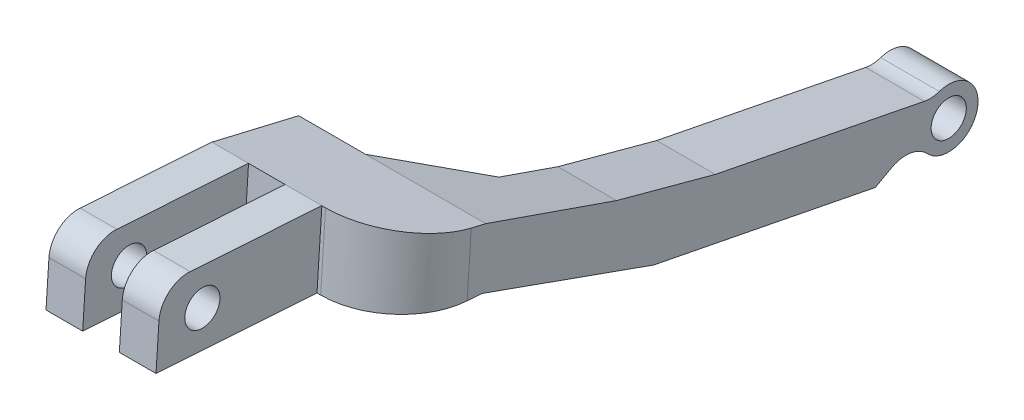
ISO-10303-21;
HEADER;
FILE_DESCRIPTION(('STEP AP214'),'2;1');
FILE_NAME('part.step','',(''),(''),'','','');
FILE_SCHEMA(('AUTOMOTIVE_DESIGN { 1 0 10303 214 1 1 1 1 }'));
ENDSEC;
DATA;
#1=APPLICATION_CONTEXT('core data for automotive mechanical design processes');
#2=APPLICATION_PROTOCOL_DEFINITION('international standard','automotive_design',2000,#1);
#3=PRODUCT_CONTEXT('',#1,'mechanical');
#4=PRODUCT('Part','Part','',(#3));
#5=PRODUCT_RELATED_PRODUCT_CATEGORY('part','',(#4));
#6=PRODUCT_DEFINITION_FORMATION('','',#4);
#7=PRODUCT_DEFINITION_CONTEXT('part definition',#1,'design');
#8=PRODUCT_DEFINITION('design','',#6,#7);
#9=PRODUCT_DEFINITION_SHAPE('','',#8);
#10=(LENGTH_UNIT() NAMED_UNIT(*) SI_UNIT(.MILLI.,.METRE.));
#11=(NAMED_UNIT(*) PLANE_ANGLE_UNIT() SI_UNIT($,.RADIAN.));
#12=(NAMED_UNIT(*) SI_UNIT($,.STERADIAN.) SOLID_ANGLE_UNIT());
#13=UNCERTAINTY_MEASURE_WITH_UNIT(LENGTH_MEASURE(1.E-05),#10,'distance_accuracy_value','');
#14=(GEOMETRIC_REPRESENTATION_CONTEXT(3) GLOBAL_UNCERTAINTY_ASSIGNED_CONTEXT((#13)) GLOBAL_UNIT_ASSIGNED_CONTEXT((#10,
#11,#12)) REPRESENTATION_CONTEXT('',''));
#15=CARTESIAN_POINT('',(0.,0.,0.));
#16=DIRECTION('',(0.,0.,1.));
#17=DIRECTION('',(1.,0.,0.));
#18=AXIS2_PLACEMENT_3D('',#15,#16,#17);
#19=CARTESIAN_POINT('',(-2.,0.,0.));
#20=DIRECTION('',(1.,0.,0.));
#21=DIRECTION('',(0.,0.,-1.));
#22=AXIS2_PLACEMENT_3D('',#19,#20,#21);
#23=PLANE('',#22);
#24=CARTESIAN_POINT('',(-2.,2.82842712474617,2.82842712474621));
#25=DIRECTION('',(1.,0.,0.));
#26=DIRECTION('',(0.,0.,-1.));
#27=AXIS2_PLACEMENT_3D('',#24,#25,#26);
#28=CIRCLE('',#27,1.2);
#29=CARTESIAN_POINT('',(-2.,2.82842712474617,1.62842712474621));
#30=VERTEX_POINT('',#29);
#31=EDGE_CURVE('E336',#30,#30,#28,.T.);
#32=ORIENTED_EDGE('',*,*,#31,.T.);
#33=EDGE_LOOP('',(#32));
#34=FACE_BOUND('',#33,.T.);
#35=DIRECTION('',(0.,-0.335768666523311,-0.941944479564033));
#36=VECTOR('',#35,1.);
#37=CARTESIAN_POINT('',(-2.,-3.51720209807534,1.2537535746378));
#38=LINE('',#37,#36);
#39=CARTESIAN_POINT('',(-2.,6.64655444127387,29.7665223895568));
#40=VERTEX_POINT('',#39);
#41=CARTESIAN_POINT('',(-2.,4.21314419530496,22.939985025488));
#42=VERTEX_POINT('',#41);
#43=EDGE_CURVE('E323',#40,#42,#38,.T.);
#44=ORIENTED_EDGE('',*,*,#43,.F.);
#45=DIRECTION('',(0.,0.997782154890409,-0.0665640397080232));
#46=VECTOR('',#45,1.);
#47=CARTESIAN_POINT('',(-2.,12.0496495140297,29.4060711295234));
#48=LINE('',#47,#46);
#49=CARTESIAN_POINT('',(-2.,10.6823280378961,29.4972878751676));
#50=VERTEX_POINT('',#49);
#51=EDGE_CURVE('E375',#40,#50,#48,.T.);
#52=ORIENTED_EDGE('',*,*,#51,.T.);
#53=DIRECTION('',(0.,-0.327934825038129,-0.944700349596216));
#54=VECTOR('',#53,1.);
#55=CARTESIAN_POINT('',(-2.,0.395273106266088,-0.13721156872764));
#56=LINE('',#55,#54);
#57=CARTESIAN_POINT('',(-2.,9.28430122630332,25.469913175018));
#58=VERTEX_POINT('',#57);
#59=EDGE_CURVE('E321',#50,#58,#56,.T.);
#60=ORIENTED_EDGE('',*,*,#59,.T.);
#61=DIRECTION('',(0.,-0.261237027153609,-0.965274684037629));
#62=VECTOR('',#61,1.);
#63=CARTESIAN_POINT('',(-2.,2.22806298460891,-0.602991625115011));
#64=LINE('',#63,#62);
#65=CARTESIAN_POINT('',(-2.,7.46200384373997,18.7364973597243));
#66=VERTEX_POINT('',#65);
#67=EDGE_CURVE('E371',#66,#58,#64,.F.);
#68=ORIENTED_EDGE('',*,*,#67,.F.);
#69=DIRECTION('',(0.,0.193266508732253,0.981146297247483));
#70=VECTOR('',#69,1.);
#71=CARTESIAN_POINT('',(-2.,3.63041791669355,-0.715120872357937));
#72=LINE('',#71,#70);
#73=CARTESIAN_POINT('',(-2.,4.65637088782305,4.49328261863853));
#74=VERTEX_POINT('',#73);
#75=EDGE_CURVE('E318',#74,#66,#72,.T.);
#76=ORIENTED_EDGE('',*,*,#75,.F.);
#77=CARTESIAN_POINT('',(-2.,6.61866348231801,4.10674960117403));
#78=DIRECTION('',(1.,0.,0.));
#79=DIRECTION('',(0.,0.,-1.));
#80=AXIS2_PLACEMENT_3D('',#77,#78,#79);
#81=CIRCLE('',#80,2.);
#82=CARTESIAN_POINT('',(-2.,4.72354530353209,3.46758836296012));
#83=VERTEX_POINT('',#82);
#84=EDGE_CURVE('E316',#74,#83,#81,.T.);
#85=ORIENTED_EDGE('',*,*,#84,.T.);
#86=CARTESIAN_POINT('',(-2.,2.82842712474617,2.82842712474621));
#87=DIRECTION('',(1.,0.,0.));
#88=DIRECTION('',(0.,0.,-1.));
#89=AXIS2_PLACEMENT_3D('',#86,#87,#88);
#90=CIRCLE('',#89,2.);
#91=CARTESIAN_POINT('',(-2.,1.46299909190755,4.28979849682739));
#92=VERTEX_POINT('',#91);
#93=EDGE_CURVE('E333',#92,#83,#90,.T.);
#94=ORIENTED_EDGE('',*,*,#93,.F.);
#95=CARTESIAN_POINT('',(-2.,0.0975710590689317,5.75116986890858));
#96=DIRECTION('',(1.,0.,0.));
#97=DIRECTION('',(0.,0.,-1.));
#98=AXIS2_PLACEMENT_3D('',#95,#96,#97);
#99=CIRCLE('',#98,2.);
#100=CARTESIAN_POINT('',(-2.,1.84923303121626,6.71640576511889));
#101=VERTEX_POINT('',#100);
#102=EDGE_CURVE('E331',#92,#101,#99,.T.);
#103=ORIENTED_EDGE('',*,*,#102,.T.);
#104=DIRECTION('',(0.,0.482617948105157,-0.875830986073665));
#105=VECTOR('',#104,1.);
#106=CARTESIAN_POINT('',(-2.,4.25747884786671,2.34604134625321));
#107=LINE('',#106,#105);
#108=CARTESIAN_POINT('',(-2.,1.23646472846601,7.8284271247462));
#109=VERTEX_POINT('',#108);
#110=EDGE_CURVE('E328',#109,#101,#107,.T.);
#111=ORIENTED_EDGE('',*,*,#110,.F.);
#112=DIRECTION('',(0.,0.193266508732253,0.981146297247483));
#113=VECTOR('',#112,1.);
#114=CARTESIAN_POINT('',(-2.,-0.294167272296385,0.0579451625710735));
#115=LINE('',#114,#113);
#116=EDGE_CURVE('E325',#109,#42,#115,.T.);
#117=ORIENTED_EDGE('',*,*,#116,.T.);
#118=EDGE_LOOP('',(#44,#52,#60,#68,#76,#85,#94,#103,#111,#117));
#119=FACE_BOUND('',#118,.T.);
#120=ADVANCED_FACE('F43',(#34,#119),#23,.F.);
#121=CARTESIAN_POINT('',(-2.,9.28430122630331,25.469913175018));
#122=DIRECTION('',(0.,-0.965274684037629,0.261237027153608));
#123=DIRECTION('',(-1.,0.,0.));
#124=AXIS2_PLACEMENT_3D('',#121,#122,#123);
#125=PLANE('',#124);
#126=DIRECTION('',(-1.,0.,0.));
#127=VECTOR('',#126,1.);
#128=CARTESIAN_POINT('',(-2.,9.28430122630331,25.469913175018));
#129=LINE('',#128,#127);
#130=CARTESIAN_POINT('',(2.,9.28430122630332,25.469913175018));
#131=VERTEX_POINT('',#130);
#132=EDGE_CURVE('E342',#131,#58,#129,.T.);
#133=ORIENTED_EDGE('',*,*,#132,.F.);
#134=DIRECTION('',(0.,0.261237027153609,0.965274684037629));
#135=VECTOR('',#134,1.);
#136=CARTESIAN_POINT('',(2.,9.28430122630331,25.469913175018));
#137=LINE('',#136,#135);
#138=CARTESIAN_POINT('',(2.,7.46200384373997,18.7364973597243));
#139=VERTEX_POINT('',#138);
#140=EDGE_CURVE('E369',#131,#139,#137,.F.);
#141=ORIENTED_EDGE('',*,*,#140,.T.);
#142=DIRECTION('',(1.,0.,0.));
#143=VECTOR('',#142,1.);
#144=CARTESIAN_POINT('',(-2.,7.46200384373995,18.7364973597242));
#145=LINE('',#144,#143);
#146=EDGE_CURVE('E366',#66,#139,#145,.T.);
#147=ORIENTED_EDGE('',*,*,#146,.F.);
#148=ORIENTED_EDGE('',*,*,#67,.T.);
#149=EDGE_LOOP('',(#133,#141,#147,#148));
#150=FACE_BOUND('',#149,.T.);
#151=ADVANCED_FACE('F425',(#150),#125,.F.);
#152=CARTESIAN_POINT('',(-2.,6.61866348231801,4.10674960117403));
#153=DIRECTION('',(1.,0.,0.));
#154=DIRECTION('',(0.,0.,-1.));
#155=AXIS2_PLACEMENT_3D('',#152,#153,#154);
#156=CYLINDRICAL_SURFACE('',#155,2.);
#157=DIRECTION('',(1.,0.,0.));
#158=VECTOR('',#157,1.);
#159=CARTESIAN_POINT('',(-2.,4.65637088782305,4.49328261863853));
#160=LINE('',#159,#158);
#161=CARTESIAN_POINT('',(2.,4.65637088782305,4.49328261863853));
#162=VERTEX_POINT('',#161);
#163=EDGE_CURVE('E339',#74,#162,#160,.T.);
#164=ORIENTED_EDGE('',*,*,#163,.T.);
#165=CARTESIAN_POINT('',(2.,6.61866348231801,4.10674960117403));
#166=DIRECTION('',(1.,0.,0.));
#167=DIRECTION('',(0.,0.,-1.));
#168=AXIS2_PLACEMENT_3D('',#165,#166,#167);
#169=CIRCLE('',#168,2.);
#170=CARTESIAN_POINT('',(2.,4.72354530353209,3.46758836296012));
#171=VERTEX_POINT('',#170);
#172=EDGE_CURVE('E285',#162,#171,#169,.T.);
#173=ORIENTED_EDGE('',*,*,#172,.T.);
#174=DIRECTION('',(1.,0.,0.));
#175=VECTOR('',#174,1.);
#176=CARTESIAN_POINT('',(-2.,4.72354530353209,3.46758836296012));
#177=LINE('',#176,#175);
#178=EDGE_CURVE('E340',#83,#171,#177,.T.);
#179=ORIENTED_EDGE('',*,*,#178,.F.);
#180=ORIENTED_EDGE('',*,*,#84,.F.);
#181=EDGE_LOOP('',(#164,#173,#179,#180));
#182=FACE_BOUND('',#181,.T.);
#183=ADVANCED_FACE('F431',(#182),#156,.F.);
#184=CARTESIAN_POINT('',(-2.,2.82842712474617,2.82842712474621));
#185=DIRECTION('',(1.,0.,0.));
#186=DIRECTION('',(0.,0.,-1.));
#187=AXIS2_PLACEMENT_3D('',#184,#185,#186);
#188=CYLINDRICAL_SURFACE('',#187,2.);
#189=ORIENTED_EDGE('',*,*,#178,.T.);
#190=CARTESIAN_POINT('',(2.,2.82842712474617,2.82842712474621));
#191=DIRECTION('',(1.,0.,0.));
#192=DIRECTION('',(0.,0.,-1.));
#193=AXIS2_PLACEMENT_3D('',#190,#191,#192);
#194=CIRCLE('',#193,2.);
#195=CARTESIAN_POINT('',(2.,1.46299909190755,4.28979849682739));
#196=VERTEX_POINT('',#195);
#197=EDGE_CURVE('E310',#196,#171,#194,.T.);
#198=ORIENTED_EDGE('',*,*,#197,.F.);
#199=DIRECTION('',(1.,0.,0.));
#200=VECTOR('',#199,1.);
#201=CARTESIAN_POINT('',(-2.,1.46299909190755,4.28979849682739));
#202=LINE('',#201,#200);
#203=EDGE_CURVE('E343',#92,#196,#202,.T.);
#204=ORIENTED_EDGE('',*,*,#203,.F.);
#205=ORIENTED_EDGE('',*,*,#93,.T.);
#206=EDGE_LOOP('',(#189,#198,#204,#205));
#207=FACE_BOUND('',#206,.T.);
#208=ADVANCED_FACE('F444',(#207),#188,.T.);
#209=CARTESIAN_POINT('',(-2.,0.0975710590689317,5.75116986890858));
#210=DIRECTION('',(1.,0.,0.));
#211=DIRECTION('',(0.,0.,-1.));
#212=AXIS2_PLACEMENT_3D('',#209,#210,#211);
#213=CYLINDRICAL_SURFACE('',#212,2.);
#214=ORIENTED_EDGE('',*,*,#203,.T.);
#215=CARTESIAN_POINT('',(2.,0.0975710590689317,5.75116986890858));
#216=DIRECTION('',(1.,0.,0.));
#217=DIRECTION('',(0.,0.,-1.));
#218=AXIS2_PLACEMENT_3D('',#215,#216,#217);
#219=CIRCLE('',#218,2.);
#220=CARTESIAN_POINT('',(2.,1.84923303121626,6.71640576511889));
#221=VERTEX_POINT('',#220);
#222=EDGE_CURVE('E307',#196,#221,#219,.T.);
#223=ORIENTED_EDGE('',*,*,#222,.T.);
#224=DIRECTION('',(1.,0.,0.));
#225=VECTOR('',#224,1.);
#226=CARTESIAN_POINT('',(-2.,1.84923303121626,6.71640576511889));
#227=LINE('',#226,#225);
#228=EDGE_CURVE('E345',#101,#221,#227,.T.);
#229=ORIENTED_EDGE('',*,*,#228,.F.);
#230=ORIENTED_EDGE('',*,*,#102,.F.);
#231=EDGE_LOOP('',(#214,#223,#229,#230));
#232=FACE_BOUND('',#231,.T.);
#233=ADVANCED_FACE('F447',(#232),#213,.F.);
#234=CARTESIAN_POINT('',(-2.,4.25747884786671,2.34604134625321));
#235=DIRECTION('',(0.,-0.875830986073665,-0.482617948105157));
#236=DIRECTION('',(0.,0.482617948105157,-0.875830986073665));
#237=AXIS2_PLACEMENT_3D('',#234,#235,#236);
#238=PLANE('',#237);
#239=ORIENTED_EDGE('',*,*,#228,.T.);
#240=DIRECTION('',(0.,0.482617948105157,-0.875830986073665));
#241=VECTOR('',#240,1.);
#242=CARTESIAN_POINT('',(2.,4.25747884786671,2.34604134625321));
#243=LINE('',#242,#241);
#244=CARTESIAN_POINT('',(2.,1.23646472846601,7.8284271247462));
#245=VERTEX_POINT('',#244);
#246=EDGE_CURVE('E304',#245,#221,#243,.T.);
#247=ORIENTED_EDGE('',*,*,#246,.F.);
#248=DIRECTION('',(1.,0.,0.));
#249=VECTOR('',#248,1.);
#250=CARTESIAN_POINT('',(-2.,1.23646472846601,7.8284271247462));
#251=LINE('',#250,#249);
#252=EDGE_CURVE('E347',#109,#245,#251,.T.);
#253=ORIENTED_EDGE('',*,*,#252,.F.);
#254=ORIENTED_EDGE('',*,*,#110,.T.);
#255=EDGE_LOOP('',(#239,#247,#253,#254));
#256=FACE_BOUND('',#255,.T.);
#257=ADVANCED_FACE('F451',(#256),#238,.T.);
#258=CARTESIAN_POINT('',(-2.,-0.294167272296385,0.0579451625710735));
#259=DIRECTION('',(0.,0.981146297247483,-0.193266508732253));
#260=DIRECTION('',(0.,0.193266508732253,0.981146297247483));
#261=AXIS2_PLACEMENT_3D('',#258,#259,#260);
#262=PLANE('',#261);
#263=ORIENTED_EDGE('',*,*,#252,.T.);
#264=DIRECTION('',(0.,0.193266508732253,0.981146297247483));
#265=VECTOR('',#264,1.);
#266=CARTESIAN_POINT('',(2.,-0.294167272296385,0.0579451625710735));
#267=LINE('',#266,#265);
#268=CARTESIAN_POINT('',(2.,4.21314419530496,22.939985025488));
#269=VERTEX_POINT('',#268);
#270=EDGE_CURVE('E301',#245,#269,#267,.T.);
#271=ORIENTED_EDGE('',*,*,#270,.T.);
#272=DIRECTION('',(1.,0.,0.));
#273=VECTOR('',#272,1.);
#274=CARTESIAN_POINT('',(-2.,4.21314419530496,22.939985025488));
#275=LINE('',#274,#273);
#276=EDGE_CURVE('E349',#42,#269,#275,.T.);
#277=ORIENTED_EDGE('',*,*,#276,.F.);
#278=ORIENTED_EDGE('',*,*,#116,.F.);
#279=EDGE_LOOP('',(#263,#271,#277,#278));
#280=FACE_BOUND('',#279,.T.);
#281=ADVANCED_FACE('F455',(#280),#262,.F.);
#282=CARTESIAN_POINT('',(-2.,-3.51720209807534,1.2537535746378));
#283=DIRECTION('',(0.,-0.941944479564033,0.335768666523311));
#284=DIRECTION('',(0.,-0.335768666523311,-0.941944479564033));
#285=AXIS2_PLACEMENT_3D('',#282,#283,#284);
#286=PLANE('',#285);
#287=ORIENTED_EDGE('',*,*,#276,.T.);
#288=DIRECTION('',(0.,-0.335768666523311,-0.941944479564033));
#289=VECTOR('',#288,1.);
#290=CARTESIAN_POINT('',(2.,-3.51720209807534,1.2537535746378));
#291=LINE('',#290,#289);
#292=CARTESIAN_POINT('',(2.,8.39134109300816,34.6612380628075));
#293=VERTEX_POINT('',#292);
#294=EDGE_CURVE('E298',#293,#269,#291,.T.);
#295=ORIENTED_EDGE('',*,*,#294,.F.);
#296=DIRECTION('',(1.,0.,0.));
#297=VECTOR('',#296,1.);
#298=CARTESIAN_POINT('',(-2.,8.39134109300816,34.6612380628075));
#299=LINE('',#298,#297);
#300=CARTESIAN_POINT('',(-6.19549815588643,8.39134109300816,34.6612380628075));
#301=VERTEX_POINT('',#300);
#302=EDGE_CURVE('E351',#301,#293,#299,.T.);
#303=ORIENTED_EDGE('',*,*,#302,.F.);
#304=DIRECTION('',(-0.628193000253413,0.261247346758396,0.732887016015644));
#305=VECTOR('',#304,1.);
#306=CARTESIAN_POINT('',(-5.38815038264097,8.05558844440082,33.7193385189061));
#307=LINE('',#306,#305);
#308=EDGE_CURVE('E377',#301,#40,#307,.F.);
#309=ORIENTED_EDGE('',*,*,#308,.T.);
#310=ORIENTED_EDGE('',*,*,#43,.T.);
#311=EDGE_LOOP('',(#287,#295,#303,#309,#310));
#312=FACE_BOUND('',#311,.T.);
#313=ADVANCED_FACE('F459',(#312),#286,.T.);
#314=CARTESIAN_POINT('',(-2.,6.05208594684601,-0.403746737008409));
#315=DIRECTION('',(0.,0.997782154890409,-0.0665640397080224));
#316=DIRECTION('',(0.,0.0665640397080224,0.997782154890409));
#317=AXIS2_PLACEMENT_3D('',#314,#315,#316);
#318=PLANE('',#317);
#319=DIRECTION('',(0.,0.0665640397080224,0.997782154890409));
#320=VECTOR('',#319,1.);
#321=CARTESIAN_POINT('',(2.,6.05208594684601,-0.403746737008409));
#322=LINE('',#321,#320);
#323=CARTESIAN_POINT('',(2.,8.45790513271618,35.6590202176979));
#324=VERTEX_POINT('',#323);
#325=EDGE_CURVE('E296',#293,#324,#322,.T.);
#326=ORIENTED_EDGE('',*,*,#325,.T.);
#327=CARTESIAN_POINT('',(-3.,8.45790513271618,35.6590202176979));
#328=DIRECTION('',(0.,0.997782154890409,-0.0665640397080224));
#329=DIRECTION('',(0.,0.0665640397080224,0.997782154890409));
#330=AXIS2_PLACEMENT_3D('',#327,#328,#329);
#331=CIRCLE('',#330,5.);
#332=CARTESIAN_POINT('',(-3.,8.79072533125629,40.64793099215));
#333=VERTEX_POINT('',#332);
#334=EDGE_CURVE('E385',#324,#333,#331,.F.);
#335=ORIENTED_EDGE('',*,*,#334,.T.);
#336=DIRECTION('',(1.,0.,0.));
#337=VECTOR('',#336,1.);
#338=CARTESIAN_POINT('',(-2.,8.79072533125629,40.64793099215));
#339=LINE('',#338,#337);
#340=CARTESIAN_POINT('',(-3.25,8.79072533125629,40.64793099215));
#341=VERTEX_POINT('',#340);
#342=EDGE_CURVE('E353',#341,#333,#339,.T.);
#343=ORIENTED_EDGE('',*,*,#342,.F.);
#344=DIRECTION('',(0.,0.0665640397080224,0.997782154890409));
#345=VECTOR('',#344,1.);
#346=CARTESIAN_POINT('',(-3.25,6.05208594684601,-0.403746737008409));
#347=LINE('',#346,#345);
#348=CARTESIAN_POINT('',(-3.25,9.52292976804454,51.6235346959445));
#349=VERTEX_POINT('',#348);
#350=EDGE_CURVE('E264',#341,#349,#347,.T.);
#351=ORIENTED_EDGE('',*,*,#350,.T.);
#352=DIRECTION('',(-1.,0.,0.));
#353=VECTOR('',#352,1.);
#354=CARTESIAN_POINT('',(-3.25,9.52292976804454,51.6235346959445));
#355=LINE('',#354,#353);
#356=CARTESIAN_POINT('',(-5.75,9.52292976804454,51.6235346959445));
#357=VERTEX_POINT('',#356);
#358=EDGE_CURVE('E273',#349,#357,#355,.T.);
#359=ORIENTED_EDGE('',*,*,#358,.T.);
#360=DIRECTION('',(0.,0.0665640397080224,0.997782154890409));
#361=VECTOR('',#360,1.);
#362=CARTESIAN_POINT('',(-5.75,6.05208594684601,-0.403746737008409));
#363=LINE('',#362,#361);
#364=CARTESIAN_POINT('',(-5.75,8.79072533125629,40.64793099215));
#365=VERTEX_POINT('',#364);
#366=EDGE_CURVE('E210',#365,#357,#363,.T.);
#367=ORIENTED_EDGE('',*,*,#366,.F.);
#368=DIRECTION('',(1.,0.,0.));
#369=VECTOR('',#368,1.);
#370=CARTESIAN_POINT('',(-8.25,8.79072533125629,40.64793099215));
#371=LINE('',#370,#369);
#372=CARTESIAN_POINT('',(-8.25,8.79072533125629,40.64793099215));
#373=VERTEX_POINT('',#372);
#374=EDGE_CURVE('E255',#373,#365,#371,.T.);
#375=ORIENTED_EDGE('',*,*,#374,.F.);
#376=DIRECTION('',(0.,-0.0665640397080222,-0.997782154890409));
#377=VECTOR('',#376,1.);
#378=CARTESIAN_POINT('',(-8.25,6.05208594684602,-0.403746737008409));
#379=LINE('',#378,#377);
#380=CARTESIAN_POINT('',(-8.25,9.52292976804454,51.6235346959445));
#381=VERTEX_POINT('',#380);
#382=EDGE_CURVE('E238',#381,#373,#379,.T.);
#383=ORIENTED_EDGE('',*,*,#382,.F.);
#384=DIRECTION('',(1.,0.,0.));
#385=VECTOR('',#384,1.);
#386=CARTESIAN_POINT('',(-10.75,9.52292976804454,51.6235346959445));
#387=LINE('',#386,#385);
#388=CARTESIAN_POINT('',(-10.75,9.52292976804454,51.6235346959445));
#389=VERTEX_POINT('',#388);
#390=EDGE_CURVE('E227',#389,#381,#387,.T.);
#391=ORIENTED_EDGE('',*,*,#390,.F.);
#392=DIRECTION('',(0.,-0.0665640397080222,-0.997782154890409));
#393=VECTOR('',#392,1.);
#394=CARTESIAN_POINT('',(-10.75,6.05208594684602,-0.403746737008409));
#395=LINE('',#394,#393);
#396=CARTESIAN_POINT('',(-10.75,8.39134109300816,34.6612380628075));
#397=VERTEX_POINT('',#396);
#398=EDGE_CURVE('E216',#389,#397,#395,.T.);
#399=ORIENTED_EDGE('',*,*,#398,.T.);
#400=DIRECTION('',(1.,0.,0.));
#401=VECTOR('',#400,1.);
#402=CARTESIAN_POINT('',(-5.75,8.39134109300816,34.6612380628075));
#403=LINE('',#402,#401);
#404=EDGE_CURVE('E200',#397,#301,#403,.T.);
#405=ORIENTED_EDGE('',*,*,#404,.T.);
#406=ORIENTED_EDGE('',*,*,#302,.T.);
#407=EDGE_LOOP('',(#326,#335,#343,#351,#359,#367,#375,#383,#391,#399,#405,#406));
#408=FACE_BOUND('',#407,.T.);
#409=ADVANCED_FACE('F224',(#408),#318,.F.);
#410=CARTESIAN_POINT('',(-2.,2.73863938441032,41.0516777291584));
#411=DIRECTION('',(0.,0.0665640397080232,0.997782154890409));
#412=DIRECTION('',(0.,-0.997782154890409,0.0665640397080232));
#413=AXIS2_PLACEMENT_3D('',#410,#411,#412);
#414=PLANE('',#413);
#415=ORIENTED_EDGE('',*,*,#342,.T.);
#416=DIRECTION('',(0.,-0.997782154890409,0.0665640397080232));
#417=VECTOR('',#416,1.);
#418=CARTESIAN_POINT('',(-3.,2.73863938441032,41.0516777291584));
#419=LINE('',#418,#417);
#420=CARTESIAN_POINT('',(-3.,13.7796361057083,40.3151107936098));
#421=VERTEX_POINT('',#420);
#422=EDGE_CURVE('E387',#333,#421,#419,.F.);
#423=ORIENTED_EDGE('',*,*,#422,.T.);
#424=DIRECTION('',(1.,0.,0.));
#425=VECTOR('',#424,1.);
#426=CARTESIAN_POINT('',(-2.,13.7796361057083,40.3151107936098));
#427=LINE('',#426,#425);
#428=CARTESIAN_POINT('',(-3.25,13.7796361057083,40.3151107936098));
#429=VERTEX_POINT('',#428);
#430=EDGE_CURVE('E359',#429,#421,#427,.T.);
#431=ORIENTED_EDGE('',*,*,#430,.F.);
#432=DIRECTION('',(0.,0.997782154890409,-0.0665640397080232));
#433=VECTOR('',#432,1.);
#434=CARTESIAN_POINT('',(-3.25,2.73863938441032,41.0516777291584));
#435=LINE('',#434,#433);
#436=EDGE_CURVE('E279',#341,#429,#435,.T.);
#437=ORIENTED_EDGE('',*,*,#436,.F.);
#438=EDGE_LOOP('',(#415,#423,#431,#437));
#439=FACE_BOUND('',#438,.T.);
#440=ADVANCED_FACE('F466',(#439),#414,.T.);
#441=CARTESIAN_POINT('',(-2.,4.04013657737562,-0.953483134376078));
#442=DIRECTION('',(0.,-0.97326319417309,0.229692740129056));
#443=DIRECTION('',(0.,-0.229692740129056,-0.97326319417309));
#444=AXIS2_PLACEMENT_3D('',#441,#442,#443);
#445=PLANE('',#444);
#446=ORIENTED_EDGE('',*,*,#430,.T.);
#447=CARTESIAN_POINT('',(-3.,12.6153307780929,35.3816700522478));
#448=DIRECTION('',(0.,-0.97326319417309,0.229692740129056));
#449=DIRECTION('',(0.,-0.229692740129056,-0.97326319417309));
#450=AXIS2_PLACEMENT_3D('',#447,#448,#449);
#451=ELLIPSE('',#450,5.06896877524852,5.);
#452=CARTESIAN_POINT('',(2.,12.6153307780929,35.3816700522478));
#453=VERTEX_POINT('',#452);
#454=EDGE_CURVE('E389',#421,#453,#451,.F.);
#455=ORIENTED_EDGE('',*,*,#454,.T.);
#456=DIRECTION('',(0.,-0.229692740129056,-0.97326319417309));
#457=VECTOR('',#456,1.);
#458=CARTESIAN_POINT('',(2.,4.04013657737562,-0.953483134376078));
#459=LINE('',#458,#457);
#460=CARTESIAN_POINT('',(2.,12.3824697125698,34.3949819039754));
#461=VERTEX_POINT('',#460);
#462=EDGE_CURVE('E294',#453,#461,#459,.T.);
#463=ORIENTED_EDGE('',*,*,#462,.T.);
#464=DIRECTION('',(1.,0.,0.));
#465=VECTOR('',#464,1.);
#466=CARTESIAN_POINT('',(-2.,12.3824697125698,34.3949819039754));
#467=LINE('',#466,#465);
#468=CARTESIAN_POINT('',(-6.19549815588643,12.3824697125698,34.3949819039754));
#469=VERTEX_POINT('',#468);
#470=EDGE_CURVE('E360',#469,#461,#467,.T.);
#471=ORIENTED_EDGE('',*,*,#470,.F.);
#472=DIRECTION('',(1.,0.,0.));
#473=VECTOR('',#472,1.);
#474=CARTESIAN_POINT('',(-5.75,12.3824697125698,34.3949819039754));
#475=LINE('',#474,#473);
#476=CARTESIAN_POINT('',(-10.75,12.3824697125698,34.3949819039754));
#477=VERTEX_POINT('',#476);
#478=EDGE_CURVE('E209',#477,#469,#475,.T.);
#479=ORIENTED_EDGE('',*,*,#478,.F.);
#480=DIRECTION('',(0.,-0.229692740129056,-0.97326319417309));
#481=VECTOR('',#480,1.);
#482=CARTESIAN_POINT('',(-10.75,4.04013657737562,-0.953483134376078));
#483=LINE('',#482,#481);
#484=CARTESIAN_POINT('',(-10.75,13.7796361057083,40.3151107936099));
#485=VERTEX_POINT('',#484);
#486=EDGE_CURVE('E219',#485,#477,#483,.T.);
#487=ORIENTED_EDGE('',*,*,#486,.F.);
#488=DIRECTION('',(1.,0.,0.));
#489=VECTOR('',#488,1.);
#490=CARTESIAN_POINT('',(-10.75,13.7796361057083,40.3151107936099));
#491=LINE('',#490,#489);
#492=CARTESIAN_POINT('',(-8.25,13.7796361057083,40.3151107936099));
#493=VERTEX_POINT('',#492);
#494=EDGE_CURVE('E237',#485,#493,#491,.T.);
#495=ORIENTED_EDGE('',*,*,#494,.T.);
#496=DIRECTION('',(1.,0.,0.));
#497=VECTOR('',#496,1.);
#498=CARTESIAN_POINT('',(-8.25,13.7796361057083,40.3151107936099));
#499=LINE('',#498,#497);
#500=CARTESIAN_POINT('',(-5.75,13.7796361057083,40.3151107936099));
#501=VERTEX_POINT('',#500);
#502=EDGE_CURVE('E251',#493,#501,#499,.T.);
#503=ORIENTED_EDGE('',*,*,#502,.T.);
#504=EDGE_CURVE('E356',#501,#429,#427,.T.);
#505=ORIENTED_EDGE('',*,*,#504,.T.);
#506=EDGE_LOOP('',(#446,#455,#463,#471,#479,#487,#495,#503,#505));
#507=FACE_BOUND('',#506,.T.);
#508=ADVANCED_FACE('F415',(#507),#445,.F.);
#509=CARTESIAN_POINT('',(-2.,0.395273106266088,-0.13721156872764));
#510=DIRECTION('',(0.,-0.944700349596216,0.327934825038129));
#511=DIRECTION('',(0.,-0.327934825038129,-0.944700349596216));
#512=AXIS2_PLACEMENT_3D('',#509,#510,#511);
#513=PLANE('',#512);
#514=DIRECTION('',(0.,-0.327934825038129,-0.944700349596216));
#515=VECTOR('',#514,1.);
#516=CARTESIAN_POINT('',(2.,0.395273106266088,-0.13721156872764));
#517=LINE('',#516,#515);
#518=EDGE_CURVE('E291',#461,#131,#517,.T.);
#519=ORIENTED_EDGE('',*,*,#518,.T.);
#520=ORIENTED_EDGE('',*,*,#132,.T.);
#521=ORIENTED_EDGE('',*,*,#59,.F.);
#522=DIRECTION('',(0.629072484740799,-0.254919036538683,-0.734359648777236));
#523=VECTOR('',#522,1.);
#524=CARTESIAN_POINT('',(13.3397732185501,4.46619189389365,11.590113827111));
#525=LINE('',#524,#523);
#526=EDGE_CURVE('E379',#50,#469,#525,.F.);
#527=ORIENTED_EDGE('',*,*,#526,.T.);
#528=ORIENTED_EDGE('',*,*,#470,.T.);
#529=EDGE_LOOP('',(#519,#520,#521,#527,#528));
#530=FACE_BOUND('',#529,.T.);
#531=ADVANCED_FACE('F472',(#530),#513,.F.);
#532=CARTESIAN_POINT('',(-2.,3.63041791669355,-0.715120872357937));
#533=DIRECTION('',(0.,0.981146297247483,-0.193266508732253));
#534=DIRECTION('',(0.,0.193266508732253,0.981146297247483));
#535=AXIS2_PLACEMENT_3D('',#532,#533,#534);
#536=PLANE('',#535);
#537=ORIENTED_EDGE('',*,*,#75,.T.);
#538=ORIENTED_EDGE('',*,*,#146,.T.);
#539=DIRECTION('',(0.,0.193266508732253,0.981146297247483));
#540=VECTOR('',#539,1.);
#541=CARTESIAN_POINT('',(2.,3.63041791669355,-0.715120872357937));
#542=LINE('',#541,#540);
#543=EDGE_CURVE('E288',#162,#139,#542,.T.);
#544=ORIENTED_EDGE('',*,*,#543,.F.);
#545=ORIENTED_EDGE('',*,*,#163,.F.);
#546=EDGE_LOOP('',(#537,#538,#544,#545));
#547=FACE_BOUND('',#546,.T.);
#548=ADVANCED_FACE('F442',(#547),#536,.T.);
#549=CARTESIAN_POINT('',(-2.,2.82842712474617,2.82842712474621));
#550=DIRECTION('',(1.,0.,0.));
#551=DIRECTION('',(0.,0.,-1.));
#552=AXIS2_PLACEMENT_3D('',#549,#550,#551);
#553=CYLINDRICAL_SURFACE('',#552,1.2);
#554=ORIENTED_EDGE('',*,*,#31,.F.);
#555=EDGE_LOOP('',(#554));
#556=FACE_BOUND('',#555,.T.);
#557=CARTESIAN_POINT('',(2.,2.82842712474617,2.82842712474621));
#558=DIRECTION('',(1.,0.,0.));
#559=DIRECTION('',(0.,0.,-1.));
#560=AXIS2_PLACEMENT_3D('',#557,#558,#559);
#561=CIRCLE('',#560,1.2);
#562=CARTESIAN_POINT('',(2.,2.82842712474617,1.62842712474621));
#563=VERTEX_POINT('',#562);
#564=EDGE_CURVE('E313',#563,#563,#561,.T.);
#565=ORIENTED_EDGE('',*,*,#564,.T.);
#566=EDGE_LOOP('',(#565));
#567=FACE_BOUND('',#566,.T.);
#568=ADVANCED_FACE('F439',(#556,#567),#553,.F.);
#569=CARTESIAN_POINT('',(2.,0.,0.));
#570=DIRECTION('',(1.,0.,0.));
#571=DIRECTION('',(0.,0.,-1.));
#572=AXIS2_PLACEMENT_3D('',#569,#570,#571);
#573=PLANE('',#572);
#574=ORIENTED_EDGE('',*,*,#462,.F.);
#575=DIRECTION('',(0.,-0.997782154890409,0.0665640397080232));
#576=VECTOR('',#575,1.);
#577=CARTESIAN_POINT('',(2.,2.4058191858702,36.0627669547063));
#578=LINE('',#577,#576);
#579=EDGE_CURVE('E382',#453,#324,#578,.T.);
#580=ORIENTED_EDGE('',*,*,#579,.T.);
#581=ORIENTED_EDGE('',*,*,#325,.F.);
#582=ORIENTED_EDGE('',*,*,#294,.T.);
#583=ORIENTED_EDGE('',*,*,#270,.F.);
#584=ORIENTED_EDGE('',*,*,#246,.T.);
#585=ORIENTED_EDGE('',*,*,#222,.F.);
#586=ORIENTED_EDGE('',*,*,#197,.T.);
#587=ORIENTED_EDGE('',*,*,#172,.F.);
#588=ORIENTED_EDGE('',*,*,#543,.T.);
#589=ORIENTED_EDGE('',*,*,#140,.F.);
#590=ORIENTED_EDGE('',*,*,#518,.F.);
#591=EDGE_LOOP('',(#574,#580,#581,#582,#583,#584,#585,#586,#587,#588,#589,#590));
#592=FACE_BOUND('',#591,.T.);
#593=ORIENTED_EDGE('',*,*,#564,.F.);
#594=EDGE_LOOP('',(#593));
#595=FACE_BOUND('',#594,.T.);
#596=ADVANCED_FACE('F437',(#592,#595),#573,.T.);
#597=CARTESIAN_POINT('',(-5.75,2.33925514616218,35.0649847998159));
#598=DIRECTION('',(0.,0.0665640397080232,0.997782154890409));
#599=DIRECTION('',(0.,-0.997782154890409,0.0665640397080232));
#600=AXIS2_PLACEMENT_3D('',#597,#598,#599);
#601=PLANE('',#600);
#602=ORIENTED_EDGE('',*,*,#478,.T.);
#603=DIRECTION('',(0.,-0.997782154890409,0.0665640397080232));
#604=VECTOR('',#603,1.);
#605=CARTESIAN_POINT('',(-6.19549815588643,8.39134109300816,34.6612380628075));
#606=LINE('',#605,#604);
#607=EDGE_CURVE('E206',#469,#301,#606,.T.);
#608=ORIENTED_EDGE('',*,*,#607,.T.);
#609=ORIENTED_EDGE('',*,*,#404,.F.);
#610=DIRECTION('',(0.,-0.997782154890409,0.0665640397080232));
#611=VECTOR('',#610,1.);
#612=CARTESIAN_POINT('',(-10.75,2.33925514616218,35.0649847998159));
#613=LINE('',#612,#611);
#614=EDGE_CURVE('E204',#477,#397,#613,.T.);
#615=ORIENTED_EDGE('',*,*,#614,.F.);
#616=EDGE_LOOP('',(#602,#608,#609,#615));
#617=FACE_BOUND('',#616,.T.);
#618=ADVANCED_FACE('F203',(#617),#601,.F.);
#619=CARTESIAN_POINT('',(-5.75,0.,0.));
#620=DIRECTION('',(1.,0.,0.));
#621=DIRECTION('',(0.,0.,-1.));
#622=AXIS2_PLACEMENT_3D('',#619,#620,#621);
#623=PLANE('',#622);
#624=DIRECTION('',(0.,-0.997782154890409,0.0665640397080225));
#625=VECTOR('',#624,1.);
#626=CARTESIAN_POINT('',(-5.75,3.47084382119853,52.0272814329529));
#627=LINE('',#626,#625);
#628=CARTESIAN_POINT('',(-5.75,12.5162762327158,51.4238425768204));
#629=VERTEX_POINT('',#628);
#630=EDGE_CURVE('E261',#629,#357,#627,.T.);
#631=ORIENTED_EDGE('',*,*,#630,.F.);
#632=CARTESIAN_POINT('',(-5.75,12.3831481532997,49.4282782670396));
#633=DIRECTION('',(1.,0.,0.));
#634=DIRECTION('',(0.,0.,-1.));
#635=AXIS2_PLACEMENT_3D('',#632,#633,#634);
#636=CIRCLE('',#635,2.);
#637=CARTESIAN_POINT('',(-5.75,14.3787124630805,49.2951501876235));
#638=VERTEX_POINT('',#637);
#639=EDGE_CURVE('E394',#629,#638,#636,.F.);
#640=ORIENTED_EDGE('',*,*,#639,.T.);
#641=DIRECTION('',(0.,0.066564039708022,0.99778215489041));
#642=VECTOR('',#641,1.);
#643=CARTESIAN_POINT('',(-5.75,11.0409967212981,-0.736566935548518));
#644=LINE('',#643,#642);
#645=EDGE_CURVE('E268',#501,#638,#644,.T.);
#646=ORIENTED_EDGE('',*,*,#645,.F.);
#647=DIRECTION('',(0.,-0.997782154890409,0.0665640397080232));
#648=VECTOR('',#647,1.);
#649=CARTESIAN_POINT('',(-5.75,2.73863938441032,41.0516777291584));
#650=LINE('',#649,#648);
#651=EDGE_CURVE('E247',#501,#365,#650,.T.);
#652=ORIENTED_EDGE('',*,*,#651,.T.);
#653=ORIENTED_EDGE('',*,*,#366,.T.);
#654=EDGE_LOOP('',(#631,#640,#646,#652,#653));
#655=FACE_BOUND('',#654,.T.);
#656=CARTESIAN_POINT('',(-5.75,11.8176930361465,48.4637781320032));
#657=DIRECTION('',(1.,0.,0.));
#658=DIRECTION('',(0.,0.,-1.));
#659=AXIS2_PLACEMENT_3D('',#656,#657,#658);
#660=CIRCLE('',#659,1.2);
#661=CARTESIAN_POINT('',(-5.75,11.8176930361465,47.2637781320032));
#662=VERTEX_POINT('',#661);
#663=EDGE_CURVE('E257',#662,#662,#660,.T.);
#664=ORIENTED_EDGE('',*,*,#663,.T.);
#665=EDGE_LOOP('',(#664));
#666=FACE_BOUND('',#665,.T.);
#667=ADVANCED_FACE('F531',(#655,#666),#623,.F.);
#668=CARTESIAN_POINT('',(-3.25,0.,0.));
#669=DIRECTION('',(1.,0.,0.));
#670=DIRECTION('',(0.,0.,-1.));
#671=AXIS2_PLACEMENT_3D('',#668,#669,#670);
#672=PLANE('',#671);
#673=DIRECTION('',(0.,0.066564039708022,0.99778215489041));
#674=VECTOR('',#673,1.);
#675=CARTESIAN_POINT('',(-3.25,11.0409967212981,-0.736566935548518));
#676=LINE('',#675,#674);
#677=CARTESIAN_POINT('',(-3.25,14.3787124630805,49.2951501876235));
#678=VERTEX_POINT('',#677);
#679=EDGE_CURVE('E270',#429,#678,#676,.T.);
#680=ORIENTED_EDGE('',*,*,#679,.T.);
#681=CARTESIAN_POINT('',(-3.25,12.3831481532997,49.4282782670396));
#682=DIRECTION('',(1.,0.,0.));
#683=DIRECTION('',(0.,0.,-1.));
#684=AXIS2_PLACEMENT_3D('',#681,#682,#683);
#685=CIRCLE('',#684,2.);
#686=CARTESIAN_POINT('',(-3.25,12.5162762327158,51.4238425768204));
#687=VERTEX_POINT('',#686);
#688=EDGE_CURVE('E398',#678,#687,#685,.T.);
#689=ORIENTED_EDGE('',*,*,#688,.T.);
#690=DIRECTION('',(0.,-0.997782154890409,0.0665640397080225));
#691=VECTOR('',#690,1.);
#692=CARTESIAN_POINT('',(-3.25,3.47084382119853,52.0272814329529));
#693=LINE('',#692,#691);
#694=EDGE_CURVE('E267',#687,#349,#693,.T.);
#695=ORIENTED_EDGE('',*,*,#694,.T.);
#696=ORIENTED_EDGE('',*,*,#350,.F.);
#697=ORIENTED_EDGE('',*,*,#436,.T.);
#698=EDGE_LOOP('',(#680,#689,#695,#696,#697));
#699=FACE_BOUND('',#698,.T.);
#700=CARTESIAN_POINT('',(-3.25,11.8176930361465,48.4637781320032));
#701=DIRECTION('',(1.,0.,0.));
#702=DIRECTION('',(0.,0.,-1.));
#703=AXIS2_PLACEMENT_3D('',#700,#701,#702);
#704=CIRCLE('',#703,1.2);
#705=CARTESIAN_POINT('',(-3.25,11.8176930361465,47.2637781320032));
#706=VERTEX_POINT('',#705);
#707=EDGE_CURVE('E258',#706,#706,#704,.T.);
#708=ORIENTED_EDGE('',*,*,#707,.F.);
#709=EDGE_LOOP('',(#708));
#710=FACE_BOUND('',#709,.T.);
#711=ADVANCED_FACE('F520',(#699,#710),#672,.T.);
#712=CARTESIAN_POINT('',(-3.25,11.0409967212981,-0.736566935548518));
#713=DIRECTION('',(0.,-0.997782154890409,0.066564039708022));
#714=DIRECTION('',(0.,-0.066564039708022,-0.997782154890409));
#715=AXIS2_PLACEMENT_3D('',#712,#713,#714);
#716=PLANE('',#715);
#717=ORIENTED_EDGE('',*,*,#645,.T.);
#718=DIRECTION('',(-1.,0.,0.));
#719=VECTOR('',#718,1.);
#720=CARTESIAN_POINT('',(-3.25,14.3787124630805,49.2951501876235));
#721=LINE('',#720,#719);
#722=EDGE_CURVE('E396',#638,#678,#721,.F.);
#723=ORIENTED_EDGE('',*,*,#722,.T.);
#724=ORIENTED_EDGE('',*,*,#679,.F.);
#725=ORIENTED_EDGE('',*,*,#504,.F.);
#726=EDGE_LOOP('',(#717,#723,#724,#725));
#727=FACE_BOUND('',#726,.T.);
#728=ADVANCED_FACE('F537',(#727),#716,.F.);
#729=CARTESIAN_POINT('',(-3.25,3.47084382119853,52.0272814329529));
#730=DIRECTION('',(0.,-0.0665640397080225,-0.997782154890409));
#731=DIRECTION('',(0.,0.997782154890409,-0.0665640397080225));
#732=AXIS2_PLACEMENT_3D('',#729,#730,#731);
#733=PLANE('',#732);
#734=ORIENTED_EDGE('',*,*,#694,.F.);
#735=DIRECTION('',(-1.,0.,0.));
#736=VECTOR('',#735,1.);
#737=CARTESIAN_POINT('',(-3.25,12.5162762327158,51.4238425768204));
#738=LINE('',#737,#736);
#739=EDGE_CURVE('E391',#687,#629,#738,.T.);
#740=ORIENTED_EDGE('',*,*,#739,.T.);
#741=ORIENTED_EDGE('',*,*,#630,.T.);
#742=ORIENTED_EDGE('',*,*,#358,.F.);
#743=EDGE_LOOP('',(#734,#740,#741,#742));
#744=FACE_BOUND('',#743,.T.);
#745=ADVANCED_FACE('F527',(#744),#733,.F.);
#746=CARTESIAN_POINT('',(-3.25,11.8176930361465,48.4637781320032));
#747=DIRECTION('',(-1.,0.,0.));
#748=DIRECTION('',(0.,0.,1.));
#749=AXIS2_PLACEMENT_3D('',#746,#747,#748);
#750=CYLINDRICAL_SURFACE('',#749,1.2);
#751=ORIENTED_EDGE('',*,*,#707,.T.);
#752=EDGE_LOOP('',(#751));
#753=FACE_BOUND('',#752,.T.);
#754=ORIENTED_EDGE('',*,*,#663,.F.);
#755=EDGE_LOOP('',(#754));
#756=FACE_BOUND('',#755,.T.);
#757=ADVANCED_FACE('F545',(#753,#756),#750,.F.);
#758=CARTESIAN_POINT('',(-8.25,2.73863938441032,41.0516777291584));
#759=DIRECTION('',(0.,0.0665640397080232,0.997782154890409));
#760=DIRECTION('',(0.,-0.997782154890409,0.0665640397080232));
#761=AXIS2_PLACEMENT_3D('',#758,#759,#760);
#762=PLANE('',#761);
#763=ORIENTED_EDGE('',*,*,#651,.F.);
#764=ORIENTED_EDGE('',*,*,#502,.F.);
#765=DIRECTION('',(0.,-0.997782154890409,0.0665640397080232));
#766=VECTOR('',#765,1.);
#767=CARTESIAN_POINT('',(-8.25,2.73863938441032,41.0516777291584));
#768=LINE('',#767,#766);
#769=EDGE_CURVE('E248',#493,#373,#768,.T.);
#770=ORIENTED_EDGE('',*,*,#769,.T.);
#771=ORIENTED_EDGE('',*,*,#374,.T.);
#772=EDGE_LOOP('',(#763,#764,#770,#771));
#773=FACE_BOUND('',#772,.T.);
#774=ADVANCED_FACE('F534',(#773),#762,.T.);
#775=CARTESIAN_POINT('',(-8.25,0.,0.));
#776=DIRECTION('',(1.,0.,0.));
#777=DIRECTION('',(0.,0.,-1.));
#778=AXIS2_PLACEMENT_3D('',#775,#776,#777);
#779=PLANE('',#778);
#780=CARTESIAN_POINT('',(-8.25,11.8176930361465,48.4637781320032));
#781=DIRECTION('',(1.,0.,0.));
#782=DIRECTION('',(0.,0.,-1.));
#783=AXIS2_PLACEMENT_3D('',#780,#781,#782);
#784=CIRCLE('',#783,1.2);
#785=CARTESIAN_POINT('',(-8.25,11.8176930361465,47.2637781320032));
#786=VERTEX_POINT('',#785);
#787=EDGE_CURVE('E897',#786,#786,#784,.T.);
#788=ORIENTED_EDGE('',*,*,#787,.F.);
#789=EDGE_LOOP('',(#788));
#790=FACE_BOUND('',#789,.T.);
#791=DIRECTION('',(0.,0.066564039708022,0.997782154890409));
#792=VECTOR('',#791,1.);
#793=CARTESIAN_POINT('',(-8.25,11.0409967212981,-0.736566935548518));
#794=LINE('',#793,#792);
#795=CARTESIAN_POINT('',(-8.25,14.3787124630805,49.2951501876235));
#796=VERTEX_POINT('',#795);
#797=EDGE_CURVE('E220',#493,#796,#794,.T.);
#798=ORIENTED_EDGE('',*,*,#797,.T.);
#799=CARTESIAN_POINT('',(-8.25,12.3831481532997,49.4282782670396));
#800=DIRECTION('',(1.,0.,0.));
#801=DIRECTION('',(0.,0.,-1.));
#802=AXIS2_PLACEMENT_3D('',#799,#800,#801);
#803=CIRCLE('',#802,2.);
#804=CARTESIAN_POINT('',(-8.25,12.5162762327158,51.4238425768204));
#805=VERTEX_POINT('',#804);
#806=EDGE_CURVE('E65',#796,#805,#803,.T.);
#807=ORIENTED_EDGE('',*,*,#806,.T.);
#808=DIRECTION('',(0.,-0.997782154890409,0.0665640397080225));
#809=VECTOR('',#808,1.);
#810=CARTESIAN_POINT('',(-8.25,3.47084382119853,52.0272814329529));
#811=LINE('',#810,#809);
#812=EDGE_CURVE('E240',#805,#381,#811,.T.);
#813=ORIENTED_EDGE('',*,*,#812,.T.);
#814=ORIENTED_EDGE('',*,*,#382,.T.);
#815=ORIENTED_EDGE('',*,*,#769,.F.);
#816=EDGE_LOOP('',(#798,#807,#813,#814,#815));
#817=FACE_BOUND('',#816,.T.);
#818=ADVANCED_FACE('F410',(#790,#817),#779,.T.);
#819=CARTESIAN_POINT('',(-10.75,3.47084382119853,52.0272814329529));
#820=DIRECTION('',(0.,0.0665640397080225,0.997782154890409));
#821=DIRECTION('',(0.,-0.997782154890409,0.0665640397080225));
#822=AXIS2_PLACEMENT_3D('',#819,#820,#821);
#823=PLANE('',#822);
#824=ORIENTED_EDGE('',*,*,#812,.F.);
#825=DIRECTION('',(1.,0.,0.));
#826=VECTOR('',#825,1.);
#827=CARTESIAN_POINT('',(-10.75,12.5162762327158,51.4238425768204));
#828=LINE('',#827,#826);
#829=CARTESIAN_POINT('',(-10.75,12.5162762327158,51.4238425768204));
#830=VERTEX_POINT('',#829);
#831=EDGE_CURVE('E51',#805,#830,#828,.F.);
#832=ORIENTED_EDGE('',*,*,#831,.T.);
#833=DIRECTION('',(0.,-0.997782154890409,0.0665640397080225));
#834=VECTOR('',#833,1.);
#835=CARTESIAN_POINT('',(-10.75,3.47084382119853,52.0272814329529));
#836=LINE('',#835,#834);
#837=EDGE_CURVE('E228',#830,#389,#836,.T.);
#838=ORIENTED_EDGE('',*,*,#837,.T.);
#839=ORIENTED_EDGE('',*,*,#390,.T.);
#840=EDGE_LOOP('',(#824,#832,#838,#839));
#841=FACE_BOUND('',#840,.T.);
#842=ADVANCED_FACE('F700',(#841),#823,.T.);
#843=CARTESIAN_POINT('',(-10.75,11.0409967212981,-0.736566935548518));
#844=DIRECTION('',(0.,0.997782154890409,-0.066564039708022));
#845=DIRECTION('',(0.,0.066564039708022,0.997782154890409));
#846=AXIS2_PLACEMENT_3D('',#843,#844,#845);
#847=PLANE('',#846);
#848=DIRECTION('',(0.,0.066564039708022,0.997782154890409));
#849=VECTOR('',#848,1.);
#850=CARTESIAN_POINT('',(-10.75,11.0409967212981,-0.736566935548518));
#851=LINE('',#850,#849);
#852=CARTESIAN_POINT('',(-10.75,14.3787124630805,49.2951501876235));
#853=VERTEX_POINT('',#852);
#854=EDGE_CURVE('E230',#485,#853,#851,.T.);
#855=ORIENTED_EDGE('',*,*,#854,.T.);
#856=DIRECTION('',(1.,0.,0.));
#857=VECTOR('',#856,1.);
#858=CARTESIAN_POINT('',(-10.75,14.3787124630805,49.2951501876235));
#859=LINE('',#858,#857);
#860=EDGE_CURVE('E400',#853,#796,#859,.T.);
#861=ORIENTED_EDGE('',*,*,#860,.T.);
#862=ORIENTED_EDGE('',*,*,#797,.F.);
#863=ORIENTED_EDGE('',*,*,#494,.F.);
#864=EDGE_LOOP('',(#855,#861,#862,#863));
#865=FACE_BOUND('',#864,.T.);
#866=ADVANCED_FACE('F406',(#865),#847,.T.);
#867=CARTESIAN_POINT('',(-10.75,0.,0.));
#868=DIRECTION('',(1.,0.,0.));
#869=DIRECTION('',(0.,0.,-1.));
#870=AXIS2_PLACEMENT_3D('',#867,#868,#869);
#871=PLANE('',#870);
#872=CARTESIAN_POINT('',(-10.75,11.8176930361465,48.4637781320032));
#873=DIRECTION('',(1.,0.,0.));
#874=DIRECTION('',(0.,0.,-1.));
#875=AXIS2_PLACEMENT_3D('',#872,#873,#874);
#876=CIRCLE('',#875,1.2);
#877=CARTESIAN_POINT('',(-10.75,11.8176930361465,47.2637781320032));
#878=VERTEX_POINT('',#877);
#879=EDGE_CURVE('E241',#878,#878,#876,.T.);
#880=ORIENTED_EDGE('',*,*,#879,.T.);
#881=EDGE_LOOP('',(#880));
#882=FACE_BOUND('',#881,.T.);
#883=ORIENTED_EDGE('',*,*,#837,.F.);
#884=CARTESIAN_POINT('',(-10.75,12.3831481532997,49.4282782670396));
#885=DIRECTION('',(1.,0.,0.));
#886=DIRECTION('',(0.,0.,-1.));
#887=AXIS2_PLACEMENT_3D('',#884,#885,#886);
#888=CIRCLE('',#887,2.);
#889=EDGE_CURVE('E12',#830,#853,#888,.F.);
#890=ORIENTED_EDGE('',*,*,#889,.T.);
#891=ORIENTED_EDGE('',*,*,#854,.F.);
#892=ORIENTED_EDGE('',*,*,#486,.T.);
#893=ORIENTED_EDGE('',*,*,#614,.T.);
#894=ORIENTED_EDGE('',*,*,#398,.F.);
#895=EDGE_LOOP('',(#883,#890,#891,#892,#893,#894));
#896=FACE_BOUND('',#895,.T.);
#897=ADVANCED_FACE('F215',(#882,#896),#871,.F.);
#898=CARTESIAN_POINT('',(-10.75,11.8176930361465,48.4637781320032));
#899=DIRECTION('',(1.,0.,0.));
#900=DIRECTION('',(0.,0.,-1.));
#901=AXIS2_PLACEMENT_3D('',#898,#899,#900);
#902=CYLINDRICAL_SURFACE('',#901,1.2);
#903=ORIENTED_EDGE('',*,*,#879,.F.);
#904=EDGE_LOOP('',(#903));
#905=FACE_BOUND('',#904,.T.);
#906=ORIENTED_EDGE('',*,*,#787,.T.);
#907=EDGE_LOOP('',(#906));
#908=FACE_BOUND('',#907,.T.);
#909=ADVANCED_FACE('F491',(#905,#908),#902,.F.);
#910=CARTESIAN_POINT('',(-6.19549815588643,2.33925514616218,35.0649847998159));
#911=DIRECTION('',(-0.766044443118975,-0.0427865399750004,-0.641362006329894));
#912=DIRECTION('',(0.,0.997782154890409,-0.0665640397080232));
#913=AXIS2_PLACEMENT_3D('',#910,#911,#912);
#914=PLANE('',#913);
#915=ORIENTED_EDGE('',*,*,#526,.F.);
#916=ORIENTED_EDGE('',*,*,#51,.F.);
#917=ORIENTED_EDGE('',*,*,#308,.F.);
#918=ORIENTED_EDGE('',*,*,#607,.F.);
#919=EDGE_LOOP('',(#915,#916,#917,#918));
#920=FACE_BOUND('',#919,.T.);
#921=ADVANCED_FACE('F486',(#920),#914,.T.);
#922=CARTESIAN_POINT('',(-3.,2.4058191858702,36.0627669547063));
#923=DIRECTION('',(0.,-0.997782154890409,0.0665640397080232));
#924=DIRECTION('',(0.,-0.0665640397080232,-0.997782154890409));
#925=AXIS2_PLACEMENT_3D('',#922,#923,#924);
#926=CYLINDRICAL_SURFACE('',#925,5.);
#927=ORIENTED_EDGE('',*,*,#454,.F.);
#928=ORIENTED_EDGE('',*,*,#422,.F.);
#929=ORIENTED_EDGE('',*,*,#334,.F.);
#930=ORIENTED_EDGE('',*,*,#579,.F.);
#931=EDGE_LOOP('',(#927,#928,#929,#930));
#932=FACE_BOUND('',#931,.T.);
#933=ADVANCED_FACE('F422',(#932),#926,.T.);
#934=CARTESIAN_POINT('',(-3.25,12.3831481532997,49.4282782670396));
#935=DIRECTION('',(-1.,0.,0.));
#936=DIRECTION('',(0.,0.,1.));
#937=AXIS2_PLACEMENT_3D('',#934,#935,#936);
#938=CYLINDRICAL_SURFACE('',#937,2.);
#939=ORIENTED_EDGE('',*,*,#688,.F.);
#940=ORIENTED_EDGE('',*,*,#722,.F.);
#941=ORIENTED_EDGE('',*,*,#639,.F.);
#942=ORIENTED_EDGE('',*,*,#739,.F.);
#943=EDGE_LOOP('',(#939,#940,#941,#942));
#944=FACE_BOUND('',#943,.T.);
#945=ADVANCED_FACE('F418',(#944),#938,.T.);
#946=CARTESIAN_POINT('',(-10.75,12.3831481532997,49.4282782670396));
#947=DIRECTION('',(1.,0.,0.));
#948=DIRECTION('',(0.,0.,-1.));
#949=AXIS2_PLACEMENT_3D('',#946,#947,#948);
#950=CYLINDRICAL_SURFACE('',#949,2.);
#951=ORIENTED_EDGE('',*,*,#889,.F.);
#952=ORIENTED_EDGE('',*,*,#831,.F.);
#953=ORIENTED_EDGE('',*,*,#806,.F.);
#954=ORIENTED_EDGE('',*,*,#860,.F.);
#955=EDGE_LOOP('',(#951,#952,#953,#954));
#956=FACE_BOUND('',#955,.T.);
#957=ADVANCED_FACE('F45',(#956),#950,.T.);
#958=CLOSED_SHELL('',(#120,#151,#183,#208,#233,#257,#281,#313,#409,#440,#508,#531,#548,#568,
#596,#618,#667,#711,#728,#745,#757,#774,#818,#842,#866,#897,#909,#921,#933,#945,#957));
#959=MANIFOLD_SOLID_BREP('B2',#958);
#960=ADVANCED_BREP_SHAPE_REPRESENTATION('',(#18,#959),#14);
#961=SHAPE_DEFINITION_REPRESENTATION(#9,#960);
ENDSEC;
END-ISO-10303-21;
